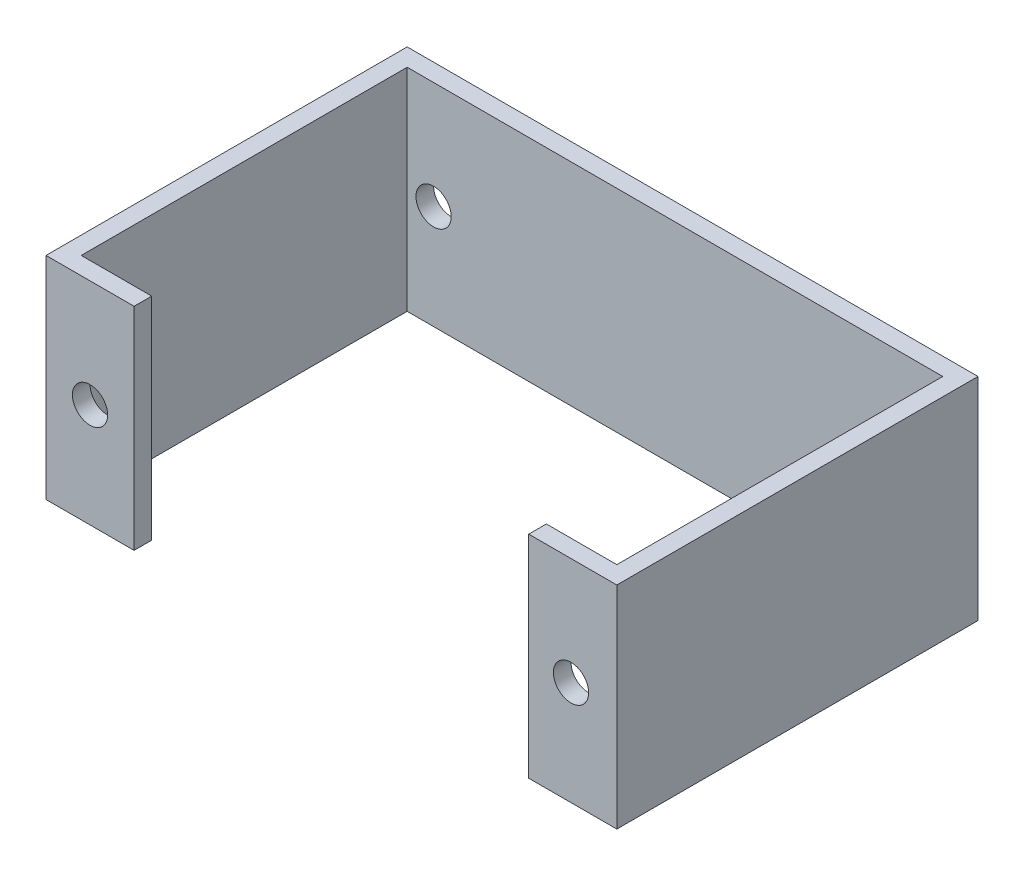
ISO-10303-21;
HEADER;
FILE_DESCRIPTION(('STEP AP214'),'2;1');
FILE_NAME('part.step','',(''),(''),'','','');
FILE_SCHEMA(('AUTOMOTIVE_DESIGN { 1 0 10303 214 1 1 1 1 }'));
ENDSEC;
DATA;
#1=APPLICATION_CONTEXT('core data for automotive mechanical design processes');
#2=APPLICATION_PROTOCOL_DEFINITION('international standard','automotive_design',2000,#1);
#3=PRODUCT_CONTEXT('',#1,'mechanical');
#4=PRODUCT('Part','Part','',(#3));
#5=PRODUCT_RELATED_PRODUCT_CATEGORY('part','',(#4));
#6=PRODUCT_DEFINITION_FORMATION('','',#4);
#7=PRODUCT_DEFINITION_CONTEXT('part definition',#1,'design');
#8=PRODUCT_DEFINITION('design','',#6,#7);
#9=PRODUCT_DEFINITION_SHAPE('','',#8);
#10=(LENGTH_UNIT() NAMED_UNIT(*) SI_UNIT(.MILLI.,.METRE.));
#11=(NAMED_UNIT(*) PLANE_ANGLE_UNIT() SI_UNIT($,.RADIAN.));
#12=(NAMED_UNIT(*) SI_UNIT($,.STERADIAN.) SOLID_ANGLE_UNIT());
#13=UNCERTAINTY_MEASURE_WITH_UNIT(LENGTH_MEASURE(1.E-05),#10,'distance_accuracy_value','');
#14=(GEOMETRIC_REPRESENTATION_CONTEXT(3) GLOBAL_UNCERTAINTY_ASSIGNED_CONTEXT((#13)) GLOBAL_UNIT_ASSIGNED_CONTEXT((#10,
#11,#12)) REPRESENTATION_CONTEXT('',''));
#15=CARTESIAN_POINT('',(0.,0.,0.));
#16=DIRECTION('',(0.,0.,1.));
#17=DIRECTION('',(1.,0.,0.));
#18=AXIS2_PLACEMENT_3D('',#15,#16,#17);
#19=CARTESIAN_POINT('',(0.,12.,19.5));
#20=DIRECTION('',(0.,0.,-1.));
#21=DIRECTION('',(-1.,0.,0.));
#22=AXIS2_PLACEMENT_3D('',#19,#20,#21);
#23=PLANE('',#22);
#24=CARTESIAN_POINT('',(1.50000000000143,5.89999999999871,19.5));
#25=DIRECTION('',(0.,0.,1.));
#26=DIRECTION('',(1.,0.,0.));
#27=AXIS2_PLACEMENT_3D('',#24,#25,#26);
#28=CIRCLE('',#27,1.);
#29=CARTESIAN_POINT('',(2.50000000000143,5.89999999999871,19.5));
#30=VERTEX_POINT('',#29);
#31=EDGE_CURVE('E269',#30,#30,#28,.T.);
#32=ORIENTED_EDGE('',*,*,#31,.F.);
#33=EDGE_LOOP('',(#32));
#34=FACE_BOUND('',#33,.T.);
#35=DIRECTION('',(1.,0.,0.));
#36=VECTOR('',#35,1.);
#37=CARTESIAN_POINT('',(0.,0.,19.5));
#38=LINE('',#37,#36);
#39=CARTESIAN_POINT('',(-0.999999999999998,0.,19.5));
#40=VERTEX_POINT('',#39);
#41=CARTESIAN_POINT('',(4.,0.,19.5));
#42=VERTEX_POINT('',#41);
#43=EDGE_CURVE('E157',#40,#42,#38,.T.);
#44=ORIENTED_EDGE('',*,*,#43,.T.);
#45=DIRECTION('',(0.,-1.,0.));
#46=VECTOR('',#45,1.);
#47=CARTESIAN_POINT('',(4.,12.,19.5));
#48=LINE('',#47,#46);
#49=CARTESIAN_POINT('',(4.,12.,19.5));
#50=VERTEX_POINT('',#49);
#51=EDGE_CURVE('E11',#50,#42,#48,.T.);
#52=ORIENTED_EDGE('',*,*,#51,.F.);
#53=DIRECTION('',(1.,0.,0.));
#54=VECTOR('',#53,1.);
#55=CARTESIAN_POINT('',(0.,12.,19.5));
#56=LINE('',#55,#54);
#57=CARTESIAN_POINT('',(-0.999999999999998,12.,19.5));
#58=VERTEX_POINT('',#57);
#59=EDGE_CURVE('E105',#58,#50,#56,.T.);
#60=ORIENTED_EDGE('',*,*,#59,.F.);
#61=DIRECTION('',(0.,-1.,0.));
#62=VECTOR('',#61,1.);
#63=CARTESIAN_POINT('',(-0.999999999999998,12.,19.5));
#64=LINE('',#63,#62);
#65=EDGE_CURVE('E153',#58,#40,#64,.T.);
#66=ORIENTED_EDGE('',*,*,#65,.T.);
#67=EDGE_LOOP('',(#44,#52,#60,#66));
#68=FACE_BOUND('',#67,.T.);
#69=ADVANCED_FACE('F37',(#34,#68),#23,.F.);
#70=CARTESIAN_POINT('',(4.,12.,18.5));
#71=DIRECTION('',(1.,0.,0.));
#72=DIRECTION('',(0.,0.,-1.));
#73=AXIS2_PLACEMENT_3D('',#70,#71,#72);
#74=PLANE('',#73);
#75=DIRECTION('',(0.,0.,1.));
#76=VECTOR('',#75,1.);
#77=CARTESIAN_POINT('',(4.,0.,18.5));
#78=LINE('',#77,#76);
#79=CARTESIAN_POINT('',(4.,0.,18.5));
#80=VERTEX_POINT('',#79);
#81=EDGE_CURVE('E160',#80,#42,#78,.T.);
#82=ORIENTED_EDGE('',*,*,#81,.F.);
#83=DIRECTION('',(0.,-1.,0.));
#84=VECTOR('',#83,1.);
#85=CARTESIAN_POINT('',(4.,12.,18.5));
#86=LINE('',#85,#84);
#87=CARTESIAN_POINT('',(4.,12.,18.5));
#88=VERTEX_POINT('',#87);
#89=EDGE_CURVE('E45',#88,#80,#86,.T.);
#90=ORIENTED_EDGE('',*,*,#89,.F.);
#91=DIRECTION('',(0.,0.,1.));
#92=VECTOR('',#91,1.);
#93=CARTESIAN_POINT('',(4.,12.,18.5));
#94=LINE('',#93,#92);
#95=EDGE_CURVE('E223',#88,#50,#94,.T.);
#96=ORIENTED_EDGE('',*,*,#95,.T.);
#97=ORIENTED_EDGE('',*,*,#51,.T.);
#98=EDGE_LOOP('',(#82,#90,#96,#97));
#99=FACE_BOUND('',#98,.T.);
#100=ADVANCED_FACE('F210',(#99),#74,.T.);
#101=CARTESIAN_POINT('',(0.,12.,18.5));
#102=DIRECTION('',(0.,0.,-1.));
#103=DIRECTION('',(-1.,0.,0.));
#104=AXIS2_PLACEMENT_3D('',#101,#102,#103);
#105=PLANE('',#104);
#106=CARTESIAN_POINT('',(1.50000000000143,5.89999999999871,18.5));
#107=DIRECTION('',(0.,0.,-1.));
#108=DIRECTION('',(-1.,0.,0.));
#109=AXIS2_PLACEMENT_3D('',#106,#107,#108);
#110=CIRCLE('',#109,1.);
#111=CARTESIAN_POINT('',(0.500000000001428,5.89999999999871,18.5));
#112=VERTEX_POINT('',#111);
#113=EDGE_CURVE('E316',#112,#112,#110,.T.);
#114=ORIENTED_EDGE('',*,*,#113,.F.);
#115=EDGE_LOOP('',(#114));
#116=FACE_BOUND('',#115,.T.);
#117=DIRECTION('',(1.,0.,0.));
#118=VECTOR('',#117,1.);
#119=CARTESIAN_POINT('',(0.,0.,18.5));
#120=LINE('',#119,#118);
#121=CARTESIAN_POINT('',(0.,0.,18.5));
#122=VERTEX_POINT('',#121);
#123=EDGE_CURVE('E164',#122,#80,#120,.T.);
#124=ORIENTED_EDGE('',*,*,#123,.F.);
#125=DIRECTION('',(0.,-1.,0.));
#126=VECTOR('',#125,1.);
#127=CARTESIAN_POINT('',(0.,12.,18.5));
#128=LINE('',#127,#126);
#129=CARTESIAN_POINT('',(0.,12.,18.5));
#130=VERTEX_POINT('',#129);
#131=EDGE_CURVE('E200',#130,#122,#128,.T.);
#132=ORIENTED_EDGE('',*,*,#131,.F.);
#133=DIRECTION('',(1.,0.,0.));
#134=VECTOR('',#133,1.);
#135=CARTESIAN_POINT('',(0.,12.,18.5));
#136=LINE('',#135,#134);
#137=EDGE_CURVE('E207',#130,#88,#136,.T.);
#138=ORIENTED_EDGE('',*,*,#137,.T.);
#139=ORIENTED_EDGE('',*,*,#89,.T.);
#140=EDGE_LOOP('',(#124,#132,#138,#139));
#141=FACE_BOUND('',#140,.T.);
#142=ADVANCED_FACE('F205',(#116,#141),#105,.T.);
#143=CARTESIAN_POINT('',(0.,12.,0.));
#144=DIRECTION('',(1.,0.,0.));
#145=DIRECTION('',(0.,0.,-1.));
#146=AXIS2_PLACEMENT_3D('',#143,#144,#145);
#147=PLANE('',#146);
#148=DIRECTION('',(0.,0.,1.));
#149=VECTOR('',#148,1.);
#150=CARTESIAN_POINT('',(0.,0.,0.));
#151=LINE('',#150,#149);
#152=CARTESIAN_POINT('',(0.,0.,0.));
#153=VERTEX_POINT('',#152);
#154=EDGE_CURVE('E167',#153,#122,#151,.T.);
#155=ORIENTED_EDGE('',*,*,#154,.F.);
#156=DIRECTION('',(0.,-1.,0.));
#157=VECTOR('',#156,1.);
#158=CARTESIAN_POINT('',(0.,12.,0.));
#159=LINE('',#158,#157);
#160=CARTESIAN_POINT('',(0.,12.,0.));
#161=VERTEX_POINT('',#160);
#162=EDGE_CURVE('E198',#161,#153,#159,.T.);
#163=ORIENTED_EDGE('',*,*,#162,.F.);
#164=DIRECTION('',(0.,0.,1.));
#165=VECTOR('',#164,1.);
#166=CARTESIAN_POINT('',(0.,12.,0.));
#167=LINE('',#166,#165);
#168=EDGE_CURVE('E220',#161,#130,#167,.T.);
#169=ORIENTED_EDGE('',*,*,#168,.T.);
#170=ORIENTED_EDGE('',*,*,#131,.T.);
#171=EDGE_LOOP('',(#155,#163,#169,#170));
#172=FACE_BOUND('',#171,.T.);
#173=ADVANCED_FACE('F217',(#172),#147,.T.);
#174=CARTESIAN_POINT('',(0.,12.,0.));
#175=DIRECTION('',(0.,0.,1.));
#176=DIRECTION('',(1.,0.,0.));
#177=AXIS2_PLACEMENT_3D('',#174,#175,#176);
#178=PLANE('',#177);
#179=CARTESIAN_POINT('',(28.8000000000014,5.89999999999871,0.));
#180=DIRECTION('',(0.,0.,1.));
#181=DIRECTION('',(1.,0.,0.));
#182=AXIS2_PLACEMENT_3D('',#179,#180,#181);
#183=CIRCLE('',#182,0.999999999999998);
#184=CARTESIAN_POINT('',(29.8000000000014,5.89999999999871,0.));
#185=VERTEX_POINT('',#184);
#186=EDGE_CURVE('E161',#185,#185,#183,.T.);
#187=ORIENTED_EDGE('',*,*,#186,.F.);
#188=EDGE_LOOP('',(#187));
#189=FACE_BOUND('',#188,.T.);
#190=CARTESIAN_POINT('',(1.50000000000143,5.89999999999871,0.));
#191=DIRECTION('',(0.,0.,1.));
#192=DIRECTION('',(1.,0.,0.));
#193=AXIS2_PLACEMENT_3D('',#190,#191,#192);
#194=CIRCLE('',#193,1.);
#195=CARTESIAN_POINT('',(2.50000000000143,5.89999999999871,0.));
#196=VERTEX_POINT('',#195);
#197=EDGE_CURVE('E307',#196,#196,#194,.T.);
#198=ORIENTED_EDGE('',*,*,#197,.F.);
#199=EDGE_LOOP('',(#198));
#200=FACE_BOUND('',#199,.T.);
#201=DIRECTION('',(-1.,0.,0.));
#202=VECTOR('',#201,1.);
#203=CARTESIAN_POINT('',(0.,0.,0.));
#204=LINE('',#203,#202);
#205=CARTESIAN_POINT('',(30.4,0.,0.));
#206=VERTEX_POINT('',#205);
#207=EDGE_CURVE('E170',#206,#153,#204,.T.);
#208=ORIENTED_EDGE('',*,*,#207,.F.);
#209=DIRECTION('',(0.,-1.,0.));
#210=VECTOR('',#209,1.);
#211=CARTESIAN_POINT('',(30.4,12.,0.));
#212=LINE('',#211,#210);
#213=CARTESIAN_POINT('',(30.4,12.,0.));
#214=VERTEX_POINT('',#213);
#215=EDGE_CURVE('E196',#214,#206,#212,.T.);
#216=ORIENTED_EDGE('',*,*,#215,.F.);
#217=DIRECTION('',(-1.,0.,0.));
#218=VECTOR('',#217,1.);
#219=CARTESIAN_POINT('',(0.,12.,0.));
#220=LINE('',#219,#218);
#221=EDGE_CURVE('E225',#214,#161,#220,.T.);
#222=ORIENTED_EDGE('',*,*,#221,.T.);
#223=ORIENTED_EDGE('',*,*,#162,.T.);
#224=EDGE_LOOP('',(#208,#216,#222,#223));
#225=FACE_BOUND('',#224,.T.);
#226=ADVANCED_FACE('F324',(#189,#200,#225),#178,.T.);
#227=CARTESIAN_POINT('',(30.4,12.,0.));
#228=DIRECTION('',(-1.,0.,0.));
#229=DIRECTION('',(0.,0.,1.));
#230=AXIS2_PLACEMENT_3D('',#227,#228,#229);
#231=PLANE('',#230);
#232=DIRECTION('',(0.,0.,-1.));
#233=VECTOR('',#232,1.);
#234=CARTESIAN_POINT('',(30.4,0.,0.));
#235=LINE('',#234,#233);
#236=CARTESIAN_POINT('',(30.4,0.,18.5));
#237=VERTEX_POINT('',#236);
#238=EDGE_CURVE('E173',#237,#206,#235,.T.);
#239=ORIENTED_EDGE('',*,*,#238,.F.);
#240=DIRECTION('',(0.,-1.,0.));
#241=VECTOR('',#240,1.);
#242=CARTESIAN_POINT('',(30.4,12.,18.5));
#243=LINE('',#242,#241);
#244=CARTESIAN_POINT('',(30.4,12.,18.5));
#245=VERTEX_POINT('',#244);
#246=EDGE_CURVE('E194',#245,#237,#243,.T.);
#247=ORIENTED_EDGE('',*,*,#246,.F.);
#248=DIRECTION('',(0.,0.,-1.));
#249=VECTOR('',#248,1.);
#250=CARTESIAN_POINT('',(30.4,12.,0.));
#251=LINE('',#250,#249);
#252=EDGE_CURVE('E231',#245,#214,#251,.T.);
#253=ORIENTED_EDGE('',*,*,#252,.T.);
#254=ORIENTED_EDGE('',*,*,#215,.T.);
#255=EDGE_LOOP('',(#239,#247,#253,#254));
#256=FACE_BOUND('',#255,.T.);
#257=ADVANCED_FACE('F327',(#256),#231,.T.);
#258=CARTESIAN_POINT('',(30.4,12.,18.5));
#259=DIRECTION('',(0.,0.,-1.));
#260=DIRECTION('',(-1.,0.,0.));
#261=AXIS2_PLACEMENT_3D('',#258,#259,#260);
#262=PLANE('',#261);
#263=CARTESIAN_POINT('',(28.8000000000014,5.89999999999871,18.5));
#264=DIRECTION('',(0.,0.,-1.));
#265=DIRECTION('',(-1.,0.,0.));
#266=AXIS2_PLACEMENT_3D('',#263,#264,#265);
#267=CIRCLE('',#266,0.999999999999998);
#268=CARTESIAN_POINT('',(27.8000000000014,5.89999999999871,18.5));
#269=VERTEX_POINT('',#268);
#270=EDGE_CURVE('E301',#269,#269,#267,.T.);
#271=ORIENTED_EDGE('',*,*,#270,.F.);
#272=EDGE_LOOP('',(#271));
#273=FACE_BOUND('',#272,.T.);
#274=DIRECTION('',(1.,0.,0.));
#275=VECTOR('',#274,1.);
#276=CARTESIAN_POINT('',(30.4,0.,18.5));
#277=LINE('',#276,#275);
#278=CARTESIAN_POINT('',(26.4,0.,18.5));
#279=VERTEX_POINT('',#278);
#280=EDGE_CURVE('E176',#279,#237,#277,.T.);
#281=ORIENTED_EDGE('',*,*,#280,.F.);
#282=DIRECTION('',(0.,-1.,0.));
#283=VECTOR('',#282,1.);
#284=CARTESIAN_POINT('',(26.4,12.,18.5));
#285=LINE('',#284,#283);
#286=CARTESIAN_POINT('',(26.4,12.,18.5));
#287=VERTEX_POINT('',#286);
#288=EDGE_CURVE('E192',#287,#279,#285,.T.);
#289=ORIENTED_EDGE('',*,*,#288,.F.);
#290=DIRECTION('',(1.,0.,0.));
#291=VECTOR('',#290,1.);
#292=CARTESIAN_POINT('',(30.4,12.,18.5));
#293=LINE('',#292,#291);
#294=EDGE_CURVE('E234',#287,#245,#293,.T.);
#295=ORIENTED_EDGE('',*,*,#294,.T.);
#296=ORIENTED_EDGE('',*,*,#246,.T.);
#297=EDGE_LOOP('',(#281,#289,#295,#296));
#298=FACE_BOUND('',#297,.T.);
#299=ADVANCED_FACE('F246',(#273,#298),#262,.T.);
#300=CARTESIAN_POINT('',(26.4,12.,19.5));
#301=DIRECTION('',(-1.,0.,0.));
#302=DIRECTION('',(0.,0.,1.));
#303=AXIS2_PLACEMENT_3D('',#300,#301,#302);
#304=PLANE('',#303);
#305=DIRECTION('',(0.,0.,-1.));
#306=VECTOR('',#305,1.);
#307=CARTESIAN_POINT('',(26.4,0.,19.5));
#308=LINE('',#307,#306);
#309=CARTESIAN_POINT('',(26.4,0.,19.5));
#310=VERTEX_POINT('',#309);
#311=EDGE_CURVE('E179',#310,#279,#308,.T.);
#312=ORIENTED_EDGE('',*,*,#311,.F.);
#313=DIRECTION('',(0.,-1.,0.));
#314=VECTOR('',#313,1.);
#315=CARTESIAN_POINT('',(26.4,12.,19.5));
#316=LINE('',#315,#314);
#317=CARTESIAN_POINT('',(26.4,12.,19.5));
#318=VERTEX_POINT('',#317);
#319=EDGE_CURVE('E190',#318,#310,#316,.T.);
#320=ORIENTED_EDGE('',*,*,#319,.F.);
#321=DIRECTION('',(0.,0.,-1.));
#322=VECTOR('',#321,1.);
#323=CARTESIAN_POINT('',(26.4,12.,19.5));
#324=LINE('',#323,#322);
#325=EDGE_CURVE('E237',#318,#287,#324,.T.);
#326=ORIENTED_EDGE('',*,*,#325,.T.);
#327=ORIENTED_EDGE('',*,*,#288,.T.);
#328=EDGE_LOOP('',(#312,#320,#326,#327));
#329=FACE_BOUND('',#328,.T.);
#330=ADVANCED_FACE('F241',(#329),#304,.T.);
#331=CARTESIAN_POINT('',(30.4,12.,19.5));
#332=DIRECTION('',(0.,0.,-1.));
#333=DIRECTION('',(-1.,0.,0.));
#334=AXIS2_PLACEMENT_3D('',#331,#332,#333);
#335=PLANE('',#334);
#336=CARTESIAN_POINT('',(28.8000000000014,5.89999999999871,19.5));
#337=DIRECTION('',(0.,0.,1.));
#338=DIRECTION('',(1.,0.,0.));
#339=AXIS2_PLACEMENT_3D('',#336,#337,#338);
#340=CIRCLE('',#339,0.999999999999998);
#341=CARTESIAN_POINT('',(29.8000000000014,5.89999999999871,19.5));
#342=VERTEX_POINT('',#341);
#343=EDGE_CURVE('E303',#342,#342,#340,.T.);
#344=ORIENTED_EDGE('',*,*,#343,.F.);
#345=EDGE_LOOP('',(#344));
#346=FACE_BOUND('',#345,.T.);
#347=DIRECTION('',(1.,0.,0.));
#348=VECTOR('',#347,1.);
#349=CARTESIAN_POINT('',(30.4,0.,19.5));
#350=LINE('',#349,#348);
#351=CARTESIAN_POINT('',(31.4,0.,19.5));
#352=VERTEX_POINT('',#351);
#353=EDGE_CURVE('E182',#310,#352,#350,.T.);
#354=ORIENTED_EDGE('',*,*,#353,.T.);
#355=DIRECTION('',(0.,-1.,0.));
#356=VECTOR('',#355,1.);
#357=CARTESIAN_POINT('',(31.4,12.,19.5));
#358=LINE('',#357,#356);
#359=CARTESIAN_POINT('',(31.4,12.,19.5));
#360=VERTEX_POINT('',#359);
#361=EDGE_CURVE('E148',#360,#352,#358,.T.);
#362=ORIENTED_EDGE('',*,*,#361,.F.);
#363=DIRECTION('',(1.,0.,0.));
#364=VECTOR('',#363,1.);
#365=CARTESIAN_POINT('',(30.4,12.,19.5));
#366=LINE('',#365,#364);
#367=EDGE_CURVE('E139',#318,#360,#366,.T.);
#368=ORIENTED_EDGE('',*,*,#367,.F.);
#369=ORIENTED_EDGE('',*,*,#319,.T.);
#370=EDGE_LOOP('',(#354,#362,#368,#369));
#371=FACE_BOUND('',#370,.T.);
#372=ADVANCED_FACE('F250',(#346,#371),#335,.F.);
#373=CARTESIAN_POINT('',(31.4,12.,0.));
#374=DIRECTION('',(-1.,0.,0.));
#375=DIRECTION('',(0.,0.,1.));
#376=AXIS2_PLACEMENT_3D('',#373,#374,#375);
#377=PLANE('',#376);
#378=DIRECTION('',(0.,0.,-1.));
#379=VECTOR('',#378,1.);
#380=CARTESIAN_POINT('',(31.4,0.,0.));
#381=LINE('',#380,#379);
#382=CARTESIAN_POINT('',(31.4,0.,-1.));
#383=VERTEX_POINT('',#382);
#384=EDGE_CURVE('E147',#352,#383,#381,.T.);
#385=ORIENTED_EDGE('',*,*,#384,.T.);
#386=DIRECTION('',(0.,-1.,0.));
#387=VECTOR('',#386,1.);
#388=CARTESIAN_POINT('',(31.4,12.,-1.));
#389=LINE('',#388,#387);
#390=CARTESIAN_POINT('',(31.4,12.,-1.));
#391=VERTEX_POINT('',#390);
#392=EDGE_CURVE('E144',#391,#383,#389,.T.);
#393=ORIENTED_EDGE('',*,*,#392,.F.);
#394=DIRECTION('',(0.,0.,-1.));
#395=VECTOR('',#394,1.);
#396=CARTESIAN_POINT('',(31.4,12.,0.));
#397=LINE('',#396,#395);
#398=EDGE_CURVE('E132',#360,#391,#397,.T.);
#399=ORIENTED_EDGE('',*,*,#398,.F.);
#400=ORIENTED_EDGE('',*,*,#361,.T.);
#401=EDGE_LOOP('',(#385,#393,#399,#400));
#402=FACE_BOUND('',#401,.T.);
#403=ADVANCED_FACE('F145',(#402),#377,.F.);
#404=CARTESIAN_POINT('',(0.,12.,-1.));
#405=DIRECTION('',(0.,0.,1.));
#406=DIRECTION('',(1.,0.,0.));
#407=AXIS2_PLACEMENT_3D('',#404,#405,#406);
#408=PLANE('',#407);
#409=CARTESIAN_POINT('',(28.8000000000014,5.89999999999871,-1.));
#410=DIRECTION('',(0.,0.,1.));
#411=DIRECTION('',(1.,0.,0.));
#412=AXIS2_PLACEMENT_3D('',#409,#410,#411);
#413=CIRCLE('',#412,0.999999999999998);
#414=CARTESIAN_POINT('',(29.8000000000014,5.89999999999871,-1.));
#415=VERTEX_POINT('',#414);
#416=EDGE_CURVE('E304',#415,#415,#413,.T.);
#417=ORIENTED_EDGE('',*,*,#416,.T.);
#418=EDGE_LOOP('',(#417));
#419=FACE_BOUND('',#418,.T.);
#420=CARTESIAN_POINT('',(1.50000000000143,5.89999999999871,-1.));
#421=DIRECTION('',(0.,0.,1.));
#422=DIRECTION('',(1.,0.,0.));
#423=AXIS2_PLACEMENT_3D('',#420,#421,#422);
#424=CIRCLE('',#423,1.);
#425=CARTESIAN_POINT('',(2.50000000000143,5.89999999999871,-1.));
#426=VERTEX_POINT('',#425);
#427=EDGE_CURVE('E309',#426,#426,#424,.T.);
#428=ORIENTED_EDGE('',*,*,#427,.T.);
#429=EDGE_LOOP('',(#428));
#430=FACE_BOUND('',#429,.T.);
#431=DIRECTION('',(1.,0.,0.));
#432=VECTOR('',#431,1.);
#433=CARTESIAN_POINT('',(0.,0.,-1.));
#434=LINE('',#433,#432);
#435=CARTESIAN_POINT('',(-1.,0.,-1.));
#436=VERTEX_POINT('',#435);
#437=EDGE_CURVE('E93',#383,#436,#434,.F.);
#438=ORIENTED_EDGE('',*,*,#437,.T.);
#439=DIRECTION('',(0.,-1.,0.));
#440=VECTOR('',#439,1.);
#441=CARTESIAN_POINT('',(-1.,12.,-1.));
#442=LINE('',#441,#440);
#443=CARTESIAN_POINT('',(-1.,12.,-1.));
#444=VERTEX_POINT('',#443);
#445=EDGE_CURVE('E149',#444,#436,#442,.T.);
#446=ORIENTED_EDGE('',*,*,#445,.F.);
#447=DIRECTION('',(1.,0.,0.));
#448=VECTOR('',#447,1.);
#449=CARTESIAN_POINT('',(0.,12.,-1.));
#450=LINE('',#449,#448);
#451=EDGE_CURVE('E136',#391,#444,#450,.F.);
#452=ORIENTED_EDGE('',*,*,#451,.F.);
#453=ORIENTED_EDGE('',*,*,#392,.T.);
#454=EDGE_LOOP('',(#438,#446,#452,#453));
#455=FACE_BOUND('',#454,.T.);
#456=ADVANCED_FACE('F151',(#419,#430,#455),#408,.F.);
#457=CARTESIAN_POINT('',(-1.,12.,0.));
#458=DIRECTION('',(1.,0.,0.));
#459=DIRECTION('',(0.,0.,-1.));
#460=AXIS2_PLACEMENT_3D('',#457,#458,#459);
#461=PLANE('',#460);
#462=DIRECTION('',(0.,0.,1.));
#463=VECTOR('',#462,1.);
#464=CARTESIAN_POINT('',(-1.,0.,0.));
#465=LINE('',#464,#463);
#466=EDGE_CURVE('E99',#436,#40,#465,.T.);
#467=ORIENTED_EDGE('',*,*,#466,.T.);
#468=ORIENTED_EDGE('',*,*,#65,.F.);
#469=DIRECTION('',(0.,0.,1.));
#470=VECTOR('',#469,1.);
#471=CARTESIAN_POINT('',(-1.,12.,0.));
#472=LINE('',#471,#470);
#473=EDGE_CURVE('E53',#444,#58,#472,.T.);
#474=ORIENTED_EDGE('',*,*,#473,.F.);
#475=ORIENTED_EDGE('',*,*,#445,.T.);
#476=EDGE_LOOP('',(#467,#468,#474,#475));
#477=FACE_BOUND('',#476,.T.);
#478=ADVANCED_FACE('F270',(#477),#461,.F.);
#479=CARTESIAN_POINT('',(0.,12.,0.));
#480=DIRECTION('',(0.,-1.,0.));
#481=DIRECTION('',(-1.,0.,0.));
#482=AXIS2_PLACEMENT_3D('',#479,#480,#481);
#483=PLANE('',#482);
#484=ORIENTED_EDGE('',*,*,#59,.T.);
#485=ORIENTED_EDGE('',*,*,#95,.F.);
#486=ORIENTED_EDGE('',*,*,#137,.F.);
#487=ORIENTED_EDGE('',*,*,#168,.F.);
#488=ORIENTED_EDGE('',*,*,#221,.F.);
#489=ORIENTED_EDGE('',*,*,#252,.F.);
#490=ORIENTED_EDGE('',*,*,#294,.F.);
#491=ORIENTED_EDGE('',*,*,#325,.F.);
#492=ORIENTED_EDGE('',*,*,#367,.T.);
#493=ORIENTED_EDGE('',*,*,#398,.T.);
#494=ORIENTED_EDGE('',*,*,#451,.T.);
#495=ORIENTED_EDGE('',*,*,#473,.T.);
#496=EDGE_LOOP('',(#484,#485,#486,#487,#488,#489,#490,#491,#492,#493,#494,#495));
#497=FACE_BOUND('',#496,.T.);
#498=ADVANCED_FACE('F134',(#497),#483,.F.);
#499=CARTESIAN_POINT('',(0.,0.,0.));
#500=DIRECTION('',(0.,-1.,0.));
#501=DIRECTION('',(-1.,0.,0.));
#502=AXIS2_PLACEMENT_3D('',#499,#500,#501);
#503=PLANE('',#502);
#504=ORIENTED_EDGE('',*,*,#43,.F.);
#505=ORIENTED_EDGE('',*,*,#466,.F.);
#506=ORIENTED_EDGE('',*,*,#437,.F.);
#507=ORIENTED_EDGE('',*,*,#384,.F.);
#508=ORIENTED_EDGE('',*,*,#353,.F.);
#509=ORIENTED_EDGE('',*,*,#311,.T.);
#510=ORIENTED_EDGE('',*,*,#280,.T.);
#511=ORIENTED_EDGE('',*,*,#238,.T.);
#512=ORIENTED_EDGE('',*,*,#207,.T.);
#513=ORIENTED_EDGE('',*,*,#154,.T.);
#514=ORIENTED_EDGE('',*,*,#123,.T.);
#515=ORIENTED_EDGE('',*,*,#81,.T.);
#516=EDGE_LOOP('',(#504,#505,#506,#507,#508,#509,#510,#511,#512,#513,#514,#515));
#517=FACE_BOUND('',#516,.T.);
#518=ADVANCED_FACE('F213',(#517),#503,.T.);
#519=CARTESIAN_POINT('',(1.50000000000143,5.89999999999871,-1.));
#520=DIRECTION('',(0.,0.,1.));
#521=DIRECTION('',(1.,0.,0.));
#522=AXIS2_PLACEMENT_3D('',#519,#520,#521);
#523=CYLINDRICAL_SURFACE('',#522,1.);
#524=ORIENTED_EDGE('',*,*,#197,.T.);
#525=EDGE_LOOP('',(#524));
#526=FACE_BOUND('',#525,.T.);
#527=ORIENTED_EDGE('',*,*,#427,.F.);
#528=EDGE_LOOP('',(#527));
#529=FACE_BOUND('',#528,.T.);
#530=ADVANCED_FACE('F282',(#526,#529),#523,.F.);
#531=CARTESIAN_POINT('',(28.8000000000014,5.89999999999871,-1.));
#532=DIRECTION('',(0.,0.,1.));
#533=DIRECTION('',(1.,0.,0.));
#534=AXIS2_PLACEMENT_3D('',#531,#532,#533);
#535=CYLINDRICAL_SURFACE('',#534,0.999999999999998);
#536=ORIENTED_EDGE('',*,*,#186,.T.);
#537=EDGE_LOOP('',(#536));
#538=FACE_BOUND('',#537,.T.);
#539=ORIENTED_EDGE('',*,*,#416,.F.);
#540=EDGE_LOOP('',(#539));
#541=FACE_BOUND('',#540,.T.);
#542=ADVANCED_FACE('F286',(#538,#541),#535,.F.);
#543=ORIENTED_EDGE('',*,*,#270,.T.);
#544=EDGE_LOOP('',(#543));
#545=FACE_BOUND('',#544,.T.);
#546=ORIENTED_EDGE('',*,*,#343,.T.);
#547=EDGE_LOOP('',(#546));
#548=FACE_BOUND('',#547,.T.);
#549=ADVANCED_FACE('F289',(#545,#548),#535,.F.);
#550=ORIENTED_EDGE('',*,*,#113,.T.);
#551=EDGE_LOOP('',(#550));
#552=FACE_BOUND('',#551,.T.);
#553=ORIENTED_EDGE('',*,*,#31,.T.);
#554=EDGE_LOOP('',(#553));
#555=FACE_BOUND('',#554,.T.);
#556=ADVANCED_FACE('F288',(#552,#555),#523,.F.);
#557=CLOSED_SHELL('',(#69,#100,#142,#173,#226,#257,#299,#330,#372,#403,#456,#478,#498,#518,#530,
#542,#549,#556));
#558=MANIFOLD_SOLID_BREP('B2',#557);
#559=ADVANCED_BREP_SHAPE_REPRESENTATION('',(#18,#558),#14);
#560=SHAPE_DEFINITION_REPRESENTATION(#9,#559);
ENDSEC;
END-ISO-10303-21;
